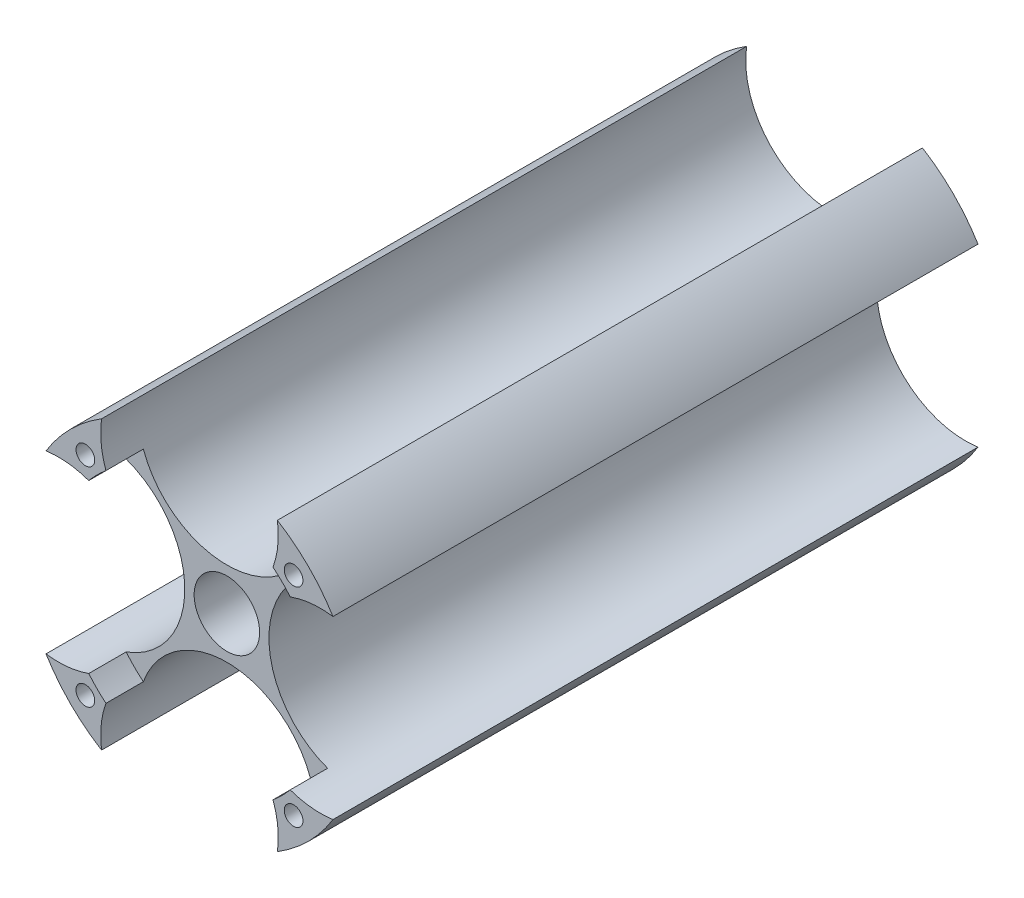
ISO-10303-21;
HEADER;
FILE_DESCRIPTION(('STEP AP214'),'2;1');
FILE_NAME('part.step','',(''),(''),'','','');
FILE_SCHEMA(('AUTOMOTIVE_DESIGN { 1 0 10303 214 1 1 1 1 }'));
ENDSEC;
DATA;
#1=APPLICATION_CONTEXT('core data for automotive mechanical design processes');
#2=APPLICATION_PROTOCOL_DEFINITION('international standard','automotive_design',2000,#1);
#3=PRODUCT_CONTEXT('',#1,'mechanical');
#4=PRODUCT('Part','Part','',(#3));
#5=PRODUCT_RELATED_PRODUCT_CATEGORY('part','',(#4));
#6=PRODUCT_DEFINITION_FORMATION('','',#4);
#7=PRODUCT_DEFINITION_CONTEXT('part definition',#1,'design');
#8=PRODUCT_DEFINITION('design','',#6,#7);
#9=PRODUCT_DEFINITION_SHAPE('','',#8);
#10=(LENGTH_UNIT() NAMED_UNIT(*) SI_UNIT(.MILLI.,.METRE.));
#11=(NAMED_UNIT(*) PLANE_ANGLE_UNIT() SI_UNIT($,.RADIAN.));
#12=(NAMED_UNIT(*) SI_UNIT($,.STERADIAN.) SOLID_ANGLE_UNIT());
#13=UNCERTAINTY_MEASURE_WITH_UNIT(LENGTH_MEASURE(1.E-05),#10,'distance_accuracy_value','');
#14=(GEOMETRIC_REPRESENTATION_CONTEXT(3) GLOBAL_UNCERTAINTY_ASSIGNED_CONTEXT((#13)) GLOBAL_UNIT_ASSIGNED_CONTEXT((#10,
#11,#12)) REPRESENTATION_CONTEXT('',''));
#15=CARTESIAN_POINT('',(0.,0.,0.));
#16=DIRECTION('',(0.,0.,1.));
#17=DIRECTION('',(1.,0.,0.));
#18=AXIS2_PLACEMENT_3D('',#15,#16,#17);
#19=CARTESIAN_POINT('',(0.,0.,65.));
#20=DIRECTION('',(0.,0.,1.));
#21=DIRECTION('',(1.,0.,0.));
#22=AXIS2_PLACEMENT_3D('',#19,#20,#21);
#23=PLANE('',#22);
#24=CARTESIAN_POINT('',(0.,0.,65.));
#25=DIRECTION('',(0.,0.,1.));
#26=DIRECTION('',(1.,0.,0.));
#27=AXIS2_PLACEMENT_3D('',#24,#25,#26);
#28=CIRCLE('',#27,14.);
#29=CARTESIAN_POINT('',(-8.93649202250903,10.7767857142857,65.));
#30=VERTEX_POINT('',#29);
#31=CARTESIAN_POINT('',(-10.7767857142857,8.93649202250902,65.));
#32=VERTEX_POINT('',#31);
#33=EDGE_CURVE('E154',#30,#32,#28,.T.);
#34=ORIENTED_EDGE('',*,*,#33,.T.);
#35=CARTESIAN_POINT('',(-14.,0.,65.));
#36=DIRECTION('',(0.,0.,1.));
#37=DIRECTION('',(1.,0.,0.));
#38=AXIS2_PLACEMENT_3D('',#35,#36,#37);
#39=CIRCLE('',#38,9.5);
#40=CARTESIAN_POINT('',(-10.7767857142857,-8.93649202250902,65.));
#41=VERTEX_POINT('',#40);
#42=EDGE_CURVE('E252',#41,#32,#39,.T.);
#43=ORIENTED_EDGE('',*,*,#42,.F.);
#44=CARTESIAN_POINT('',(0.,0.,65.));
#45=DIRECTION('',(0.,0.,1.));
#46=DIRECTION('',(1.,0.,0.));
#47=AXIS2_PLACEMENT_3D('',#44,#45,#46);
#48=CIRCLE('',#47,14.);
#49=CARTESIAN_POINT('',(-8.93649202250902,-10.7767857142857,65.));
#50=VERTEX_POINT('',#49);
#51=EDGE_CURVE('E226',#41,#50,#48,.T.);
#52=ORIENTED_EDGE('',*,*,#51,.T.);
#53=CARTESIAN_POINT('',(0.,-14.,65.));
#54=DIRECTION('',(0.,0.,1.));
#55=DIRECTION('',(1.,0.,0.));
#56=AXIS2_PLACEMENT_3D('',#53,#54,#55);
#57=CIRCLE('',#56,9.5);
#58=CARTESIAN_POINT('',(8.93649202250902,-10.7767857142857,65.));
#59=VERTEX_POINT('',#58);
#60=EDGE_CURVE('E57',#59,#50,#57,.T.);
#61=ORIENTED_EDGE('',*,*,#60,.F.);
#62=CARTESIAN_POINT('',(0.,0.,65.));
#63=DIRECTION('',(0.,0.,1.));
#64=DIRECTION('',(1.,0.,0.));
#65=AXIS2_PLACEMENT_3D('',#62,#63,#64);
#66=CIRCLE('',#65,14.);
#67=CARTESIAN_POINT('',(10.7767857142857,-8.93649202250902,65.));
#68=VERTEX_POINT('',#67);
#69=EDGE_CURVE('E205',#59,#68,#66,.T.);
#70=ORIENTED_EDGE('',*,*,#69,.T.);
#71=CARTESIAN_POINT('',(14.,0.,65.));
#72=DIRECTION('',(0.,0.,1.));
#73=DIRECTION('',(1.,0.,0.));
#74=AXIS2_PLACEMENT_3D('',#71,#72,#73);
#75=CIRCLE('',#74,9.5);
#76=CARTESIAN_POINT('',(10.7767857142857,8.93649202250902,65.));
#77=VERTEX_POINT('',#76);
#78=EDGE_CURVE('E50',#77,#68,#75,.T.);
#79=ORIENTED_EDGE('',*,*,#78,.F.);
#80=CARTESIAN_POINT('',(0.,0.,65.));
#81=DIRECTION('',(0.,0.,1.));
#82=DIRECTION('',(1.,0.,0.));
#83=AXIS2_PLACEMENT_3D('',#80,#81,#82);
#84=CIRCLE('',#83,14.);
#85=CARTESIAN_POINT('',(8.93649202250903,10.7767857142857,65.));
#86=VERTEX_POINT('',#85);
#87=EDGE_CURVE('E157',#77,#86,#84,.T.);
#88=ORIENTED_EDGE('',*,*,#87,.T.);
#89=CARTESIAN_POINT('',(0.,14.,65.));
#90=DIRECTION('',(0.,0.,1.));
#91=DIRECTION('',(1.,0.,0.));
#92=AXIS2_PLACEMENT_3D('',#89,#90,#91);
#93=CIRCLE('',#92,9.50000000000001);
#94=EDGE_CURVE('E249',#30,#86,#93,.T.);
#95=ORIENTED_EDGE('',*,*,#94,.F.);
#96=EDGE_LOOP('',(#34,#43,#52,#61,#70,#79,#88,#95));
#97=FACE_BOUND('',#96,.T.);
#98=CARTESIAN_POINT('',(0.,0.,65.));
#99=DIRECTION('',(0.,0.,1.));
#100=DIRECTION('',(1.,0.,0.));
#101=AXIS2_PLACEMENT_3D('',#98,#99,#100);
#102=CIRCLE('',#101,3.5);
#103=CARTESIAN_POINT('',(3.5,0.,65.));
#104=VERTEX_POINT('',#103);
#105=EDGE_CURVE('E256',#104,#104,#102,.T.);
#106=ORIENTED_EDGE('',*,*,#105,.F.);
#107=EDGE_LOOP('',(#106));
#108=FACE_BOUND('',#107,.T.);
#109=ADVANCED_FACE('F35',(#97,#108),#23,.T.);
#110=CARTESIAN_POINT('',(14.,0.,65.));
#111=DIRECTION('',(0.,0.,-1.));
#112=DIRECTION('',(-1.,0.,0.));
#113=AXIS2_PLACEMENT_3D('',#110,#111,#112);
#114=CYLINDRICAL_SURFACE('',#113,9.5);
#115=CARTESIAN_POINT('',(14.,0.,0.));
#116=DIRECTION('',(0.,0.,1.));
#117=DIRECTION('',(1.,0.,0.));
#118=AXIS2_PLACEMENT_3D('',#115,#116,#117);
#119=CIRCLE('',#118,9.5);
#120=CARTESIAN_POINT('',(15.3482142857143,9.40384592811877,0.));
#121=VERTEX_POINT('',#120);
#122=CARTESIAN_POINT('',(15.3482142857143,-9.40384592811876,0.));
#123=VERTEX_POINT('',#122);
#124=EDGE_CURVE('E271',#121,#123,#119,.T.);
#125=ORIENTED_EDGE('',*,*,#124,.F.);
#126=DIRECTION('',(0.,0.,-1.));
#127=VECTOR('',#126,1.);
#128=CARTESIAN_POINT('',(15.3482142857143,9.40384592811877,65.));
#129=LINE('',#128,#127);
#130=CARTESIAN_POINT('',(15.3482142857143,9.40384592811877,69.));
#131=VERTEX_POINT('',#130);
#132=EDGE_CURVE('E11',#131,#121,#129,.T.);
#133=ORIENTED_EDGE('',*,*,#132,.F.);
#134=CARTESIAN_POINT('',(14.,0.,69.));
#135=DIRECTION('',(0.,0.,1.));
#136=DIRECTION('',(1.,0.,0.));
#137=AXIS2_PLACEMENT_3D('',#134,#135,#136);
#138=CIRCLE('',#137,9.5);
#139=CARTESIAN_POINT('',(10.7767857142857,8.93649202250902,69.));
#140=VERTEX_POINT('',#139);
#141=EDGE_CURVE('E187',#140,#131,#138,.F.);
#142=ORIENTED_EDGE('',*,*,#141,.F.);
#143=DIRECTION('',(0.,0.,-1.));
#144=VECTOR('',#143,1.);
#145=CARTESIAN_POINT('',(10.7767857142857,8.93649202250902,69.));
#146=LINE('',#145,#144);
#147=EDGE_CURVE('E203',#140,#77,#146,.T.);
#148=ORIENTED_EDGE('',*,*,#147,.T.);
#149=ORIENTED_EDGE('',*,*,#78,.T.);
#150=DIRECTION('',(0.,0.,-1.));
#151=VECTOR('',#150,1.);
#152=CARTESIAN_POINT('',(10.7767857142857,-8.93649202250902,69.));
#153=LINE('',#152,#151);
#154=CARTESIAN_POINT('',(10.7767857142857,-8.93649202250902,69.));
#155=VERTEX_POINT('',#154);
#156=EDGE_CURVE('E220',#155,#68,#153,.T.);
#157=ORIENTED_EDGE('',*,*,#156,.F.);
#158=CARTESIAN_POINT('',(14.,0.,69.));
#159=DIRECTION('',(0.,0.,1.));
#160=DIRECTION('',(1.,0.,0.));
#161=AXIS2_PLACEMENT_3D('',#158,#159,#160);
#162=CIRCLE('',#161,9.5);
#163=CARTESIAN_POINT('',(15.3482142857143,-9.40384592811876,69.));
#164=VERTEX_POINT('',#163);
#165=EDGE_CURVE('E215',#164,#155,#162,.F.);
#166=ORIENTED_EDGE('',*,*,#165,.F.);
#167=DIRECTION('',(0.,0.,-1.));
#168=VECTOR('',#167,1.);
#169=CARTESIAN_POINT('',(15.3482142857143,-9.40384592811876,65.));
#170=LINE('',#169,#168);
#171=EDGE_CURVE('E259',#164,#123,#170,.T.);
#172=ORIENTED_EDGE('',*,*,#171,.T.);
#173=EDGE_LOOP('',(#125,#133,#142,#148,#149,#157,#166,#172));
#174=FACE_BOUND('',#173,.T.);
#175=ADVANCED_FACE('F323',(#174),#114,.F.);
#176=CARTESIAN_POINT('',(0.,0.,65.));
#177=DIRECTION('',(0.,0.,-1.));
#178=DIRECTION('',(-1.,0.,0.));
#179=AXIS2_PLACEMENT_3D('',#176,#177,#178);
#180=CYLINDRICAL_SURFACE('',#179,18.);
#181=CARTESIAN_POINT('',(0.,0.,0.));
#182=DIRECTION('',(0.,0.,1.));
#183=DIRECTION('',(1.,0.,0.));
#184=AXIS2_PLACEMENT_3D('',#181,#182,#183);
#185=CIRCLE('',#184,18.);
#186=CARTESIAN_POINT('',(9.40384592811878,15.3482142857143,0.));
#187=VERTEX_POINT('',#186);
#188=EDGE_CURVE('E274',#121,#187,#185,.T.);
#189=ORIENTED_EDGE('',*,*,#188,.T.);
#190=DIRECTION('',(0.,0.,-1.));
#191=VECTOR('',#190,1.);
#192=CARTESIAN_POINT('',(9.40384592811878,15.3482142857143,65.));
#193=LINE('',#192,#191);
#194=CARTESIAN_POINT('',(9.40384592811878,15.3482142857143,69.));
#195=VERTEX_POINT('',#194);
#196=EDGE_CURVE('E43',#195,#187,#193,.T.);
#197=ORIENTED_EDGE('',*,*,#196,.F.);
#198=CARTESIAN_POINT('',(0.,0.,69.));
#199=DIRECTION('',(0.,0.,1.));
#200=DIRECTION('',(1.,0.,0.));
#201=AXIS2_PLACEMENT_3D('',#198,#199,#200);
#202=CIRCLE('',#201,18.);
#203=EDGE_CURVE('E190',#131,#195,#202,.T.);
#204=ORIENTED_EDGE('',*,*,#203,.F.);
#205=ORIENTED_EDGE('',*,*,#132,.T.);
#206=EDGE_LOOP('',(#189,#197,#204,#205));
#207=FACE_BOUND('',#206,.T.);
#208=ADVANCED_FACE('F305',(#207),#180,.T.);
#209=CARTESIAN_POINT('',(0.,14.,65.));
#210=DIRECTION('',(0.,0.,-1.));
#211=DIRECTION('',(-1.,0.,0.));
#212=AXIS2_PLACEMENT_3D('',#209,#210,#211);
#213=CYLINDRICAL_SURFACE('',#212,9.50000000000001);
#214=CARTESIAN_POINT('',(0.,14.,0.));
#215=DIRECTION('',(0.,0.,1.));
#216=DIRECTION('',(1.,0.,0.));
#217=AXIS2_PLACEMENT_3D('',#214,#215,#216);
#218=CIRCLE('',#217,9.50000000000001);
#219=CARTESIAN_POINT('',(-9.40384592811879,15.3482142857143,0.));
#220=VERTEX_POINT('',#219);
#221=EDGE_CURVE('E277',#220,#187,#218,.T.);
#222=ORIENTED_EDGE('',*,*,#221,.F.);
#223=DIRECTION('',(0.,0.,-1.));
#224=VECTOR('',#223,1.);
#225=CARTESIAN_POINT('',(-9.40384592811879,15.3482142857143,65.));
#226=LINE('',#225,#224);
#227=CARTESIAN_POINT('',(-9.40384592811879,15.3482142857143,69.));
#228=VERTEX_POINT('',#227);
#229=EDGE_CURVE('E164',#228,#220,#226,.T.);
#230=ORIENTED_EDGE('',*,*,#229,.F.);
#231=CARTESIAN_POINT('',(0.,14.,69.));
#232=DIRECTION('',(0.,0.,1.));
#233=DIRECTION('',(1.,0.,0.));
#234=AXIS2_PLACEMENT_3D('',#231,#232,#233);
#235=CIRCLE('',#234,9.50000000000001);
#236=CARTESIAN_POINT('',(-8.93649202250903,10.7767857142857,69.));
#237=VERTEX_POINT('',#236);
#238=EDGE_CURVE('E161',#237,#228,#235,.F.);
#239=ORIENTED_EDGE('',*,*,#238,.F.);
#240=DIRECTION('',(0.,0.,-1.));
#241=VECTOR('',#240,1.);
#242=CARTESIAN_POINT('',(-8.93649202250903,10.7767857142857,69.));
#243=LINE('',#242,#241);
#244=EDGE_CURVE('E148',#237,#30,#243,.T.);
#245=ORIENTED_EDGE('',*,*,#244,.T.);
#246=ORIENTED_EDGE('',*,*,#94,.T.);
#247=DIRECTION('',(0.,0.,-1.));
#248=VECTOR('',#247,1.);
#249=CARTESIAN_POINT('',(8.93649202250903,10.7767857142857,69.));
#250=LINE('',#249,#248);
#251=CARTESIAN_POINT('',(8.93649202250903,10.7767857142857,69.));
#252=VERTEX_POINT('',#251);
#253=EDGE_CURVE('E198',#252,#86,#250,.T.);
#254=ORIENTED_EDGE('',*,*,#253,.F.);
#255=CARTESIAN_POINT('',(0.,14.,69.));
#256=DIRECTION('',(0.,0.,1.));
#257=DIRECTION('',(1.,0.,0.));
#258=AXIS2_PLACEMENT_3D('',#255,#256,#257);
#259=CIRCLE('',#258,9.50000000000001);
#260=EDGE_CURVE('E193',#195,#252,#259,.F.);
#261=ORIENTED_EDGE('',*,*,#260,.F.);
#262=ORIENTED_EDGE('',*,*,#196,.T.);
#263=EDGE_LOOP('',(#222,#230,#239,#245,#246,#254,#261,#262));
#264=FACE_BOUND('',#263,.T.);
#265=ADVANCED_FACE('F163',(#264),#213,.F.);
#266=CARTESIAN_POINT('',(-15.3482142857143,9.40384592811877,0.));
#267=VERTEX_POINT('',#266);
#268=EDGE_CURVE('E279',#220,#267,#185,.T.);
#269=ORIENTED_EDGE('',*,*,#268,.T.);
#270=DIRECTION('',(0.,0.,-1.));
#271=VECTOR('',#270,1.);
#272=CARTESIAN_POINT('',(-15.3482142857143,9.40384592811877,65.));
#273=LINE('',#272,#271);
#274=CARTESIAN_POINT('',(-15.3482142857143,9.40384592811877,69.));
#275=VERTEX_POINT('',#274);
#276=EDGE_CURVE('E298',#275,#267,#273,.T.);
#277=ORIENTED_EDGE('',*,*,#276,.F.);
#278=CARTESIAN_POINT('',(0.,0.,69.));
#279=DIRECTION('',(0.,0.,1.));
#280=DIRECTION('',(1.,0.,0.));
#281=AXIS2_PLACEMENT_3D('',#278,#279,#280);
#282=CIRCLE('',#281,18.);
#283=EDGE_CURVE('E168',#228,#275,#282,.T.);
#284=ORIENTED_EDGE('',*,*,#283,.F.);
#285=ORIENTED_EDGE('',*,*,#229,.T.);
#286=EDGE_LOOP('',(#269,#277,#284,#285));
#287=FACE_BOUND('',#286,.T.);
#288=ADVANCED_FACE('F338',(#287),#180,.T.);
#289=CARTESIAN_POINT('',(-14.,0.,65.));
#290=DIRECTION('',(0.,0.,-1.));
#291=DIRECTION('',(-1.,0.,0.));
#292=AXIS2_PLACEMENT_3D('',#289,#290,#291);
#293=CYLINDRICAL_SURFACE('',#292,9.5);
#294=CARTESIAN_POINT('',(-14.,0.,0.));
#295=DIRECTION('',(0.,0.,1.));
#296=DIRECTION('',(1.,0.,0.));
#297=AXIS2_PLACEMENT_3D('',#294,#295,#296);
#298=CIRCLE('',#297,9.5);
#299=CARTESIAN_POINT('',(-15.3482142857143,-9.40384592811878,0.));
#300=VERTEX_POINT('',#299);
#301=EDGE_CURVE('E282',#300,#267,#298,.T.);
#302=ORIENTED_EDGE('',*,*,#301,.F.);
#303=DIRECTION('',(0.,0.,-1.));
#304=VECTOR('',#303,1.);
#305=CARTESIAN_POINT('',(-15.3482142857143,-9.40384592811878,65.));
#306=LINE('',#305,#304);
#307=CARTESIAN_POINT('',(-15.3482142857143,-9.40384592811877,69.));
#308=VERTEX_POINT('',#307);
#309=EDGE_CURVE('E296',#308,#300,#306,.T.);
#310=ORIENTED_EDGE('',*,*,#309,.F.);
#311=CARTESIAN_POINT('',(-14.,0.,69.));
#312=DIRECTION('',(0.,0.,1.));
#313=DIRECTION('',(1.,0.,0.));
#314=AXIS2_PLACEMENT_3D('',#311,#312,#313);
#315=CIRCLE('',#314,9.5);
#316=CARTESIAN_POINT('',(-10.7767857142857,-8.93649202250902,69.));
#317=VERTEX_POINT('',#316);
#318=EDGE_CURVE('E230',#317,#308,#315,.F.);
#319=ORIENTED_EDGE('',*,*,#318,.F.);
#320=DIRECTION('',(0.,0.,-1.));
#321=VECTOR('',#320,1.);
#322=CARTESIAN_POINT('',(-10.7767857142857,-8.93649202250902,69.));
#323=LINE('',#322,#321);
#324=EDGE_CURVE('E245',#317,#41,#323,.T.);
#325=ORIENTED_EDGE('',*,*,#324,.T.);
#326=ORIENTED_EDGE('',*,*,#42,.T.);
#327=DIRECTION('',(0.,0.,-1.));
#328=VECTOR('',#327,1.);
#329=CARTESIAN_POINT('',(-10.7767857142857,8.93649202250902,69.));
#330=LINE('',#329,#328);
#331=CARTESIAN_POINT('',(-10.7767857142857,8.93649202250902,69.));
#332=VERTEX_POINT('',#331);
#333=EDGE_CURVE('E158',#332,#32,#330,.T.);
#334=ORIENTED_EDGE('',*,*,#333,.F.);
#335=CARTESIAN_POINT('',(-14.,0.,69.));
#336=DIRECTION('',(0.,0.,1.));
#337=DIRECTION('',(1.,0.,0.));
#338=AXIS2_PLACEMENT_3D('',#335,#336,#337);
#339=CIRCLE('',#338,9.5);
#340=EDGE_CURVE('E173',#275,#332,#339,.F.);
#341=ORIENTED_EDGE('',*,*,#340,.F.);
#342=ORIENTED_EDGE('',*,*,#276,.T.);
#343=EDGE_LOOP('',(#302,#310,#319,#325,#326,#334,#341,#342));
#344=FACE_BOUND('',#343,.T.);
#345=ADVANCED_FACE('F336',(#344),#293,.F.);
#346=CARTESIAN_POINT('',(-9.40384592811876,-15.3482142857143,0.));
#347=VERTEX_POINT('',#346);
#348=EDGE_CURVE('E285',#300,#347,#185,.T.);
#349=ORIENTED_EDGE('',*,*,#348,.T.);
#350=DIRECTION('',(0.,0.,-1.));
#351=VECTOR('',#350,1.);
#352=CARTESIAN_POINT('',(-9.40384592811876,-15.3482142857143,65.));
#353=LINE('',#352,#351);
#354=CARTESIAN_POINT('',(-9.40384592811876,-15.3482142857143,69.));
#355=VERTEX_POINT('',#354);
#356=EDGE_CURVE('E294',#355,#347,#353,.T.);
#357=ORIENTED_EDGE('',*,*,#356,.F.);
#358=CARTESIAN_POINT('',(0.,0.,69.));
#359=DIRECTION('',(0.,0.,1.));
#360=DIRECTION('',(1.,0.,0.));
#361=AXIS2_PLACEMENT_3D('',#358,#359,#360);
#362=CIRCLE('',#361,18.);
#363=EDGE_CURVE('E233',#308,#355,#362,.T.);
#364=ORIENTED_EDGE('',*,*,#363,.F.);
#365=ORIENTED_EDGE('',*,*,#309,.T.);
#366=EDGE_LOOP('',(#349,#357,#364,#365));
#367=FACE_BOUND('',#366,.T.);
#368=ADVANCED_FACE('F341',(#367),#180,.T.);
#369=CARTESIAN_POINT('',(0.,-14.,65.));
#370=DIRECTION('',(0.,0.,-1.));
#371=DIRECTION('',(-1.,0.,0.));
#372=AXIS2_PLACEMENT_3D('',#369,#370,#371);
#373=CYLINDRICAL_SURFACE('',#372,9.5);
#374=CARTESIAN_POINT('',(0.,-14.,0.));
#375=DIRECTION('',(0.,0.,1.));
#376=DIRECTION('',(1.,0.,0.));
#377=AXIS2_PLACEMENT_3D('',#374,#375,#376);
#378=CIRCLE('',#377,9.5);
#379=CARTESIAN_POINT('',(9.40384592811877,-15.3482142857143,0.));
#380=VERTEX_POINT('',#379);
#381=EDGE_CURVE('E286',#380,#347,#378,.T.);
#382=ORIENTED_EDGE('',*,*,#381,.F.);
#383=DIRECTION('',(0.,0.,-1.));
#384=VECTOR('',#383,1.);
#385=CARTESIAN_POINT('',(9.40384592811877,-15.3482142857143,65.));
#386=LINE('',#385,#384);
#387=CARTESIAN_POINT('',(9.40384592811877,-15.3482142857143,69.));
#388=VERTEX_POINT('',#387);
#389=EDGE_CURVE('E292',#388,#380,#386,.T.);
#390=ORIENTED_EDGE('',*,*,#389,.F.);
#391=CARTESIAN_POINT('',(0.,-14.,69.));
#392=DIRECTION('',(0.,0.,1.));
#393=DIRECTION('',(1.,0.,0.));
#394=AXIS2_PLACEMENT_3D('',#391,#392,#393);
#395=CIRCLE('',#394,9.5);
#396=CARTESIAN_POINT('',(8.93649202250902,-10.7767857142857,69.));
#397=VERTEX_POINT('',#396);
#398=EDGE_CURVE('E209',#397,#388,#395,.F.);
#399=ORIENTED_EDGE('',*,*,#398,.F.);
#400=DIRECTION('',(0.,0.,-1.));
#401=VECTOR('',#400,1.);
#402=CARTESIAN_POINT('',(8.93649202250902,-10.7767857142857,69.));
#403=LINE('',#402,#401);
#404=EDGE_CURVE('E224',#397,#59,#403,.T.);
#405=ORIENTED_EDGE('',*,*,#404,.T.);
#406=ORIENTED_EDGE('',*,*,#60,.T.);
#407=DIRECTION('',(0.,0.,-1.));
#408=VECTOR('',#407,1.);
#409=CARTESIAN_POINT('',(-8.93649202250902,-10.7767857142857,69.));
#410=LINE('',#409,#408);
#411=CARTESIAN_POINT('',(-8.93649202250902,-10.7767857142857,69.));
#412=VERTEX_POINT('',#411);
#413=EDGE_CURVE('E241',#412,#50,#410,.T.);
#414=ORIENTED_EDGE('',*,*,#413,.F.);
#415=CARTESIAN_POINT('',(0.,-14.,69.));
#416=DIRECTION('',(0.,0.,1.));
#417=DIRECTION('',(1.,0.,0.));
#418=AXIS2_PLACEMENT_3D('',#415,#416,#417);
#419=CIRCLE('',#418,9.5);
#420=EDGE_CURVE('E236',#355,#412,#419,.F.);
#421=ORIENTED_EDGE('',*,*,#420,.F.);
#422=ORIENTED_EDGE('',*,*,#356,.T.);
#423=EDGE_LOOP('',(#382,#390,#399,#405,#406,#414,#421,#422));
#424=FACE_BOUND('',#423,.T.);
#425=ADVANCED_FACE('F332',(#424),#373,.F.);
#426=EDGE_CURVE('E278',#380,#123,#185,.T.);
#427=ORIENTED_EDGE('',*,*,#426,.T.);
#428=ORIENTED_EDGE('',*,*,#171,.F.);
#429=CARTESIAN_POINT('',(0.,0.,69.));
#430=DIRECTION('',(0.,0.,1.));
#431=DIRECTION('',(1.,0.,0.));
#432=AXIS2_PLACEMENT_3D('',#429,#430,#431);
#433=CIRCLE('',#432,18.);
#434=EDGE_CURVE('E212',#388,#164,#433,.T.);
#435=ORIENTED_EDGE('',*,*,#434,.F.);
#436=ORIENTED_EDGE('',*,*,#389,.T.);
#437=EDGE_LOOP('',(#427,#428,#435,#436));
#438=FACE_BOUND('',#437,.T.);
#439=ADVANCED_FACE('F320',(#438),#180,.T.);
#440=CARTESIAN_POINT('',(-11.1369318036881,11.1369318036881,65.));
#441=DIRECTION('',(0.,0.,-1.));
#442=DIRECTION('',(-1.,0.,0.));
#443=AXIS2_PLACEMENT_3D('',#440,#441,#442);
#444=CYLINDRICAL_SURFACE('',#443,1.);
#445=CARTESIAN_POINT('',(-11.1369318036881,11.1369318036881,0.));
#446=DIRECTION('',(0.,0.,1.));
#447=DIRECTION('',(1.,0.,0.));
#448=AXIS2_PLACEMENT_3D('',#445,#446,#447);
#449=CIRCLE('',#448,1.);
#450=CARTESIAN_POINT('',(-10.1369318036881,11.1369318036881,0.));
#451=VERTEX_POINT('',#450);
#452=EDGE_CURVE('E268',#451,#451,#449,.T.);
#453=ORIENTED_EDGE('',*,*,#452,.F.);
#454=EDGE_LOOP('',(#453));
#455=FACE_BOUND('',#454,.T.);
#456=CARTESIAN_POINT('',(-11.1369318036881,11.1369318036881,69.));
#457=DIRECTION('',(0.,0.,1.));
#458=DIRECTION('',(1.,0.,0.));
#459=AXIS2_PLACEMENT_3D('',#456,#457,#458);
#460=CIRCLE('',#459,1.);
#461=CARTESIAN_POINT('',(-10.1369318036881,11.1369318036881,69.));
#462=VERTEX_POINT('',#461);
#463=EDGE_CURVE('E180',#462,#462,#460,.F.);
#464=ORIENTED_EDGE('',*,*,#463,.F.);
#465=EDGE_LOOP('',(#464));
#466=FACE_BOUND('',#465,.T.);
#467=ADVANCED_FACE('F464',(#455,#466),#444,.F.);
#468=CARTESIAN_POINT('',(11.1369318036881,11.1369318036881,65.));
#469=DIRECTION('',(0.,0.,-1.));
#470=DIRECTION('',(-1.,0.,0.));
#471=AXIS2_PLACEMENT_3D('',#468,#469,#470);
#472=CYLINDRICAL_SURFACE('',#471,1.);
#473=CARTESIAN_POINT('',(11.1369318036881,11.1369318036881,0.));
#474=DIRECTION('',(0.,0.,1.));
#475=DIRECTION('',(1.,0.,0.));
#476=AXIS2_PLACEMENT_3D('',#473,#474,#475);
#477=CIRCLE('',#476,1.);
#478=CARTESIAN_POINT('',(12.1369318036881,11.1369318036881,0.));
#479=VERTEX_POINT('',#478);
#480=EDGE_CURVE('E265',#479,#479,#477,.T.);
#481=ORIENTED_EDGE('',*,*,#480,.F.);
#482=EDGE_LOOP('',(#481));
#483=FACE_BOUND('',#482,.T.);
#484=CARTESIAN_POINT('',(11.1369318036881,11.1369318036881,69.));
#485=DIRECTION('',(0.,0.,1.));
#486=DIRECTION('',(1.,0.,0.));
#487=AXIS2_PLACEMENT_3D('',#484,#485,#486);
#488=CIRCLE('',#487,1.);
#489=CARTESIAN_POINT('',(12.1369318036881,11.1369318036881,69.));
#490=VERTEX_POINT('',#489);
#491=EDGE_CURVE('E195',#490,#490,#488,.F.);
#492=ORIENTED_EDGE('',*,*,#491,.F.);
#493=EDGE_LOOP('',(#492));
#494=FACE_BOUND('',#493,.T.);
#495=ADVANCED_FACE('F379',(#483,#494),#472,.F.);
#496=CARTESIAN_POINT('',(11.1369318036881,-11.1369318036881,65.));
#497=DIRECTION('',(0.,0.,-1.));
#498=DIRECTION('',(-1.,0.,0.));
#499=AXIS2_PLACEMENT_3D('',#496,#497,#498);
#500=CYLINDRICAL_SURFACE('',#499,0.999999999999999);
#501=CARTESIAN_POINT('',(11.1369318036881,-11.1369318036881,0.));
#502=DIRECTION('',(0.,0.,1.));
#503=DIRECTION('',(1.,0.,0.));
#504=AXIS2_PLACEMENT_3D('',#501,#502,#503);
#505=CIRCLE('',#504,0.999999999999999);
#506=CARTESIAN_POINT('',(12.1369318036881,-11.1369318036881,0.));
#507=VERTEX_POINT('',#506);
#508=EDGE_CURVE('E262',#507,#507,#505,.T.);
#509=ORIENTED_EDGE('',*,*,#508,.F.);
#510=EDGE_LOOP('',(#509));
#511=FACE_BOUND('',#510,.T.);
#512=CARTESIAN_POINT('',(11.1369318036881,-11.1369318036881,69.));
#513=DIRECTION('',(0.,0.,1.));
#514=DIRECTION('',(1.,0.,0.));
#515=AXIS2_PLACEMENT_3D('',#512,#513,#514);
#516=CIRCLE('',#515,0.999999999999999);
#517=CARTESIAN_POINT('',(12.1369318036881,-11.1369318036881,69.));
#518=VERTEX_POINT('',#517);
#519=EDGE_CURVE('E217',#518,#518,#516,.F.);
#520=ORIENTED_EDGE('',*,*,#519,.F.);
#521=EDGE_LOOP('',(#520));
#522=FACE_BOUND('',#521,.T.);
#523=ADVANCED_FACE('F371',(#511,#522),#500,.F.);
#524=CARTESIAN_POINT('',(-11.1369318036881,-11.1369318036881,65.));
#525=DIRECTION('',(0.,0.,-1.));
#526=DIRECTION('',(-1.,0.,0.));
#527=AXIS2_PLACEMENT_3D('',#524,#525,#526);
#528=CYLINDRICAL_SURFACE('',#527,0.999999999999999);
#529=CARTESIAN_POINT('',(-11.1369318036881,-11.1369318036881,0.));
#530=DIRECTION('',(0.,0.,1.));
#531=DIRECTION('',(1.,0.,0.));
#532=AXIS2_PLACEMENT_3D('',#529,#530,#531);
#533=CIRCLE('',#532,0.999999999999999);
#534=CARTESIAN_POINT('',(-10.1369318036881,-11.1369318036881,0.));
#535=VERTEX_POINT('',#534);
#536=EDGE_CURVE('E247',#535,#535,#533,.T.);
#537=ORIENTED_EDGE('',*,*,#536,.F.);
#538=EDGE_LOOP('',(#537));
#539=FACE_BOUND('',#538,.T.);
#540=CARTESIAN_POINT('',(-11.1369318036881,-11.1369318036881,69.));
#541=DIRECTION('',(0.,0.,1.));
#542=DIRECTION('',(1.,0.,0.));
#543=AXIS2_PLACEMENT_3D('',#540,#541,#542);
#544=CIRCLE('',#543,0.999999999999999);
#545=CARTESIAN_POINT('',(-10.1369318036881,-11.1369318036881,69.));
#546=VERTEX_POINT('',#545);
#547=EDGE_CURVE('E238',#546,#546,#544,.F.);
#548=ORIENTED_EDGE('',*,*,#547,.F.);
#549=EDGE_LOOP('',(#548));
#550=FACE_BOUND('',#549,.T.);
#551=ADVANCED_FACE('F37',(#539,#550),#528,.F.);
#552=CARTESIAN_POINT('',(0.,0.,65.));
#553=DIRECTION('',(0.,0.,-1.));
#554=DIRECTION('',(-1.,0.,0.));
#555=AXIS2_PLACEMENT_3D('',#552,#553,#554);
#556=CYLINDRICAL_SURFACE('',#555,3.5);
#557=ORIENTED_EDGE('',*,*,#105,.T.);
#558=EDGE_LOOP('',(#557));
#559=FACE_BOUND('',#558,.T.);
#560=CARTESIAN_POINT('',(0.,0.,0.));
#561=DIRECTION('',(0.,0.,1.));
#562=DIRECTION('',(1.,0.,0.));
#563=AXIS2_PLACEMENT_3D('',#560,#561,#562);
#564=CIRCLE('',#563,3.5);
#565=CARTESIAN_POINT('',(3.5,0.,0.));
#566=VERTEX_POINT('',#565);
#567=EDGE_CURVE('E250',#566,#566,#564,.T.);
#568=ORIENTED_EDGE('',*,*,#567,.F.);
#569=EDGE_LOOP('',(#568));
#570=FACE_BOUND('',#569,.T.);
#571=ADVANCED_FACE('F364',(#559,#570),#556,.F.);
#572=CARTESIAN_POINT('',(0.,0.,0.));
#573=DIRECTION('',(0.,0.,1.));
#574=DIRECTION('',(1.,0.,0.));
#575=AXIS2_PLACEMENT_3D('',#572,#573,#574);
#576=PLANE('',#575);
#577=ORIENTED_EDGE('',*,*,#536,.T.);
#578=EDGE_LOOP('',(#577));
#579=FACE_BOUND('',#578,.T.);
#580=ORIENTED_EDGE('',*,*,#508,.T.);
#581=EDGE_LOOP('',(#580));
#582=FACE_BOUND('',#581,.T.);
#583=ORIENTED_EDGE('',*,*,#480,.T.);
#584=EDGE_LOOP('',(#583));
#585=FACE_BOUND('',#584,.T.);
#586=ORIENTED_EDGE('',*,*,#452,.T.);
#587=EDGE_LOOP('',(#586));
#588=FACE_BOUND('',#587,.T.);
#589=ORIENTED_EDGE('',*,*,#124,.T.);
#590=ORIENTED_EDGE('',*,*,#426,.F.);
#591=ORIENTED_EDGE('',*,*,#381,.T.);
#592=ORIENTED_EDGE('',*,*,#348,.F.);
#593=ORIENTED_EDGE('',*,*,#301,.T.);
#594=ORIENTED_EDGE('',*,*,#268,.F.);
#595=ORIENTED_EDGE('',*,*,#221,.T.);
#596=ORIENTED_EDGE('',*,*,#188,.F.);
#597=EDGE_LOOP('',(#589,#590,#591,#592,#593,#594,#595,#596));
#598=FACE_BOUND('',#597,.T.);
#599=ORIENTED_EDGE('',*,*,#567,.T.);
#600=EDGE_LOOP('',(#599));
#601=FACE_BOUND('',#600,.T.);
#602=ADVANCED_FACE('F309',(#579,#582,#585,#588,#598,#601),#576,.F.);
#603=CARTESIAN_POINT('',(0.,0.,69.));
#604=DIRECTION('',(0.,0.,-1.));
#605=DIRECTION('',(-1.,0.,0.));
#606=AXIS2_PLACEMENT_3D('',#603,#604,#605);
#607=CYLINDRICAL_SURFACE('',#606,14.);
#608=ORIENTED_EDGE('',*,*,#51,.F.);
#609=ORIENTED_EDGE('',*,*,#324,.F.);
#610=CARTESIAN_POINT('',(0.,0.,69.));
#611=DIRECTION('',(0.,0.,1.));
#612=DIRECTION('',(1.,0.,0.));
#613=AXIS2_PLACEMENT_3D('',#610,#611,#612);
#614=CIRCLE('',#613,14.);
#615=EDGE_CURVE('E227',#317,#412,#614,.T.);
#616=ORIENTED_EDGE('',*,*,#615,.T.);
#617=ORIENTED_EDGE('',*,*,#413,.T.);
#618=EDGE_LOOP('',(#608,#609,#616,#617));
#619=FACE_BOUND('',#618,.T.);
#620=ADVANCED_FACE('F361',(#619),#607,.F.);
#621=CARTESIAN_POINT('',(0.,0.,69.));
#622=DIRECTION('',(0.,0.,1.));
#623=DIRECTION('',(1.,0.,0.));
#624=AXIS2_PLACEMENT_3D('',#621,#622,#623);
#625=PLANE('',#624);
#626=ORIENTED_EDGE('',*,*,#615,.F.);
#627=ORIENTED_EDGE('',*,*,#318,.T.);
#628=ORIENTED_EDGE('',*,*,#363,.T.);
#629=ORIENTED_EDGE('',*,*,#420,.T.);
#630=EDGE_LOOP('',(#626,#627,#628,#629));
#631=FACE_BOUND('',#630,.T.);
#632=ORIENTED_EDGE('',*,*,#547,.T.);
#633=EDGE_LOOP('',(#632));
#634=FACE_BOUND('',#633,.T.);
#635=ADVANCED_FACE('F385',(#631,#634),#625,.T.);
#636=CARTESIAN_POINT('',(0.,0.,69.));
#637=DIRECTION('',(0.,0.,-1.));
#638=DIRECTION('',(-1.,0.,0.));
#639=AXIS2_PLACEMENT_3D('',#636,#637,#638);
#640=CYLINDRICAL_SURFACE('',#639,14.);
#641=ORIENTED_EDGE('',*,*,#69,.F.);
#642=ORIENTED_EDGE('',*,*,#404,.F.);
#643=CARTESIAN_POINT('',(0.,0.,69.));
#644=DIRECTION('',(0.,0.,1.));
#645=DIRECTION('',(1.,0.,0.));
#646=AXIS2_PLACEMENT_3D('',#643,#644,#645);
#647=CIRCLE('',#646,14.);
#648=EDGE_CURVE('E206',#397,#155,#647,.T.);
#649=ORIENTED_EDGE('',*,*,#648,.T.);
#650=ORIENTED_EDGE('',*,*,#156,.T.);
#651=EDGE_LOOP('',(#641,#642,#649,#650));
#652=FACE_BOUND('',#651,.T.);
#653=ADVANCED_FACE('F387',(#652),#640,.F.);
#654=CARTESIAN_POINT('',(0.,0.,69.));
#655=DIRECTION('',(0.,0.,1.));
#656=DIRECTION('',(1.,0.,0.));
#657=AXIS2_PLACEMENT_3D('',#654,#655,#656);
#658=PLANE('',#657);
#659=ORIENTED_EDGE('',*,*,#648,.F.);
#660=ORIENTED_EDGE('',*,*,#398,.T.);
#661=ORIENTED_EDGE('',*,*,#434,.T.);
#662=ORIENTED_EDGE('',*,*,#165,.T.);
#663=EDGE_LOOP('',(#659,#660,#661,#662));
#664=FACE_BOUND('',#663,.T.);
#665=ORIENTED_EDGE('',*,*,#519,.T.);
#666=EDGE_LOOP('',(#665));
#667=FACE_BOUND('',#666,.T.);
#668=ADVANCED_FACE('F328',(#664,#667),#658,.T.);
#669=CARTESIAN_POINT('',(0.,0.,69.));
#670=DIRECTION('',(0.,0.,-1.));
#671=DIRECTION('',(-1.,0.,0.));
#672=AXIS2_PLACEMENT_3D('',#669,#670,#671);
#673=CYLINDRICAL_SURFACE('',#672,14.);
#674=ORIENTED_EDGE('',*,*,#87,.F.);
#675=ORIENTED_EDGE('',*,*,#147,.F.);
#676=CARTESIAN_POINT('',(0.,0.,69.));
#677=DIRECTION('',(0.,0.,1.));
#678=DIRECTION('',(1.,0.,0.));
#679=AXIS2_PLACEMENT_3D('',#676,#677,#678);
#680=CIRCLE('',#679,14.);
#681=EDGE_CURVE('E184',#140,#252,#680,.T.);
#682=ORIENTED_EDGE('',*,*,#681,.T.);
#683=ORIENTED_EDGE('',*,*,#253,.T.);
#684=EDGE_LOOP('',(#674,#675,#682,#683));
#685=FACE_BOUND('',#684,.T.);
#686=ADVANCED_FACE('F400',(#685),#673,.F.);
#687=CARTESIAN_POINT('',(0.,0.,69.));
#688=DIRECTION('',(0.,0.,1.));
#689=DIRECTION('',(1.,0.,0.));
#690=AXIS2_PLACEMENT_3D('',#687,#688,#689);
#691=PLANE('',#690);
#692=ORIENTED_EDGE('',*,*,#681,.F.);
#693=ORIENTED_EDGE('',*,*,#141,.T.);
#694=ORIENTED_EDGE('',*,*,#203,.T.);
#695=ORIENTED_EDGE('',*,*,#260,.T.);
#696=EDGE_LOOP('',(#692,#693,#694,#695));
#697=FACE_BOUND('',#696,.T.);
#698=ORIENTED_EDGE('',*,*,#491,.T.);
#699=EDGE_LOOP('',(#698));
#700=FACE_BOUND('',#699,.T.);
#701=ADVANCED_FACE('F403',(#697,#700),#691,.T.);
#702=CARTESIAN_POINT('',(0.,0.,69.));
#703=DIRECTION('',(0.,0.,-1.));
#704=DIRECTION('',(-1.,0.,0.));
#705=AXIS2_PLACEMENT_3D('',#702,#703,#704);
#706=CYLINDRICAL_SURFACE('',#705,14.);
#707=ORIENTED_EDGE('',*,*,#33,.F.);
#708=ORIENTED_EDGE('',*,*,#244,.F.);
#709=CARTESIAN_POINT('',(0.,0.,69.));
#710=DIRECTION('',(0.,0.,1.));
#711=DIRECTION('',(1.,0.,0.));
#712=AXIS2_PLACEMENT_3D('',#709,#710,#711);
#713=CIRCLE('',#712,14.);
#714=EDGE_CURVE('E152',#237,#332,#713,.T.);
#715=ORIENTED_EDGE('',*,*,#714,.T.);
#716=ORIENTED_EDGE('',*,*,#333,.T.);
#717=EDGE_LOOP('',(#707,#708,#715,#716));
#718=FACE_BOUND('',#717,.T.);
#719=ADVANCED_FACE('F150',(#718),#706,.F.);
#720=CARTESIAN_POINT('',(0.,0.,69.));
#721=DIRECTION('',(0.,0.,1.));
#722=DIRECTION('',(1.,0.,0.));
#723=AXIS2_PLACEMENT_3D('',#720,#721,#722);
#724=PLANE('',#723);
#725=ORIENTED_EDGE('',*,*,#714,.F.);
#726=ORIENTED_EDGE('',*,*,#238,.T.);
#727=ORIENTED_EDGE('',*,*,#283,.T.);
#728=ORIENTED_EDGE('',*,*,#340,.T.);
#729=EDGE_LOOP('',(#725,#726,#727,#728));
#730=FACE_BOUND('',#729,.T.);
#731=ORIENTED_EDGE('',*,*,#463,.T.);
#732=EDGE_LOOP('',(#731));
#733=FACE_BOUND('',#732,.T.);
#734=ADVANCED_FACE('F170',(#730,#733),#724,.T.);
#735=CLOSED_SHELL('',(#109,#175,#208,#265,#288,#345,#368,#425,#439,#467,#495,#523,#551,#571,
#602,#620,#635,#653,#668,#686,#701,#719,#734));
#736=MANIFOLD_SOLID_BREP('B2',#735);
#737=ADVANCED_BREP_SHAPE_REPRESENTATION('',(#18,#736),#14);
#738=SHAPE_DEFINITION_REPRESENTATION(#9,#737);
ENDSEC;
END-ISO-10303-21;
